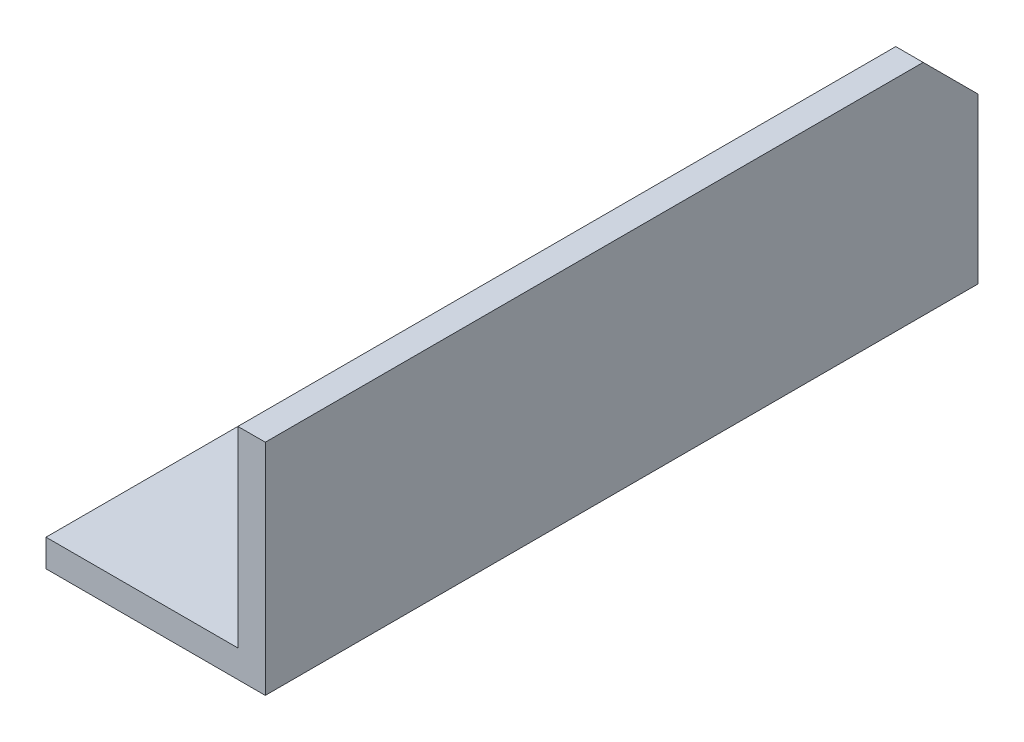
ISO-10303-21;
HEADER;
FILE_DESCRIPTION(('STEP AP214'),'2;1');
FILE_NAME('part.step','',(''),(''),'','','');
FILE_SCHEMA(('AUTOMOTIVE_DESIGN { 1 0 10303 214 1 1 1 1 }'));
ENDSEC;
DATA;
#1=APPLICATION_CONTEXT('core data for automotive mechanical design processes');
#2=APPLICATION_PROTOCOL_DEFINITION('international standard','automotive_design',2000,#1);
#3=PRODUCT_CONTEXT('',#1,'mechanical');
#4=PRODUCT('Part','Part','',(#3));
#5=PRODUCT_RELATED_PRODUCT_CATEGORY('part','',(#4));
#6=PRODUCT_DEFINITION_FORMATION('','',#4);
#7=PRODUCT_DEFINITION_CONTEXT('part definition',#1,'design');
#8=PRODUCT_DEFINITION('design','',#6,#7);
#9=PRODUCT_DEFINITION_SHAPE('','',#8);
#10=(LENGTH_UNIT() NAMED_UNIT(*) SI_UNIT(.MILLI.,.METRE.));
#11=(NAMED_UNIT(*) PLANE_ANGLE_UNIT() SI_UNIT($,.RADIAN.));
#12=(NAMED_UNIT(*) SI_UNIT($,.STERADIAN.) SOLID_ANGLE_UNIT());
#13=UNCERTAINTY_MEASURE_WITH_UNIT(LENGTH_MEASURE(1.E-05),#10,'distance_accuracy_value','');
#14=(GEOMETRIC_REPRESENTATION_CONTEXT(3) GLOBAL_UNCERTAINTY_ASSIGNED_CONTEXT((#13)) GLOBAL_UNIT_ASSIGNED_CONTEXT((#10,
#11,#12)) REPRESENTATION_CONTEXT('',''));
#15=CARTESIAN_POINT('',(0.,0.,0.));
#16=DIRECTION('',(0.,0.,1.));
#17=DIRECTION('',(1.,0.,0.));
#18=AXIS2_PLACEMENT_3D('',#15,#16,#17);
#19=CARTESIAN_POINT('',(0.,0.,-65.));
#20=DIRECTION('',(1.,0.,0.));
#21=DIRECTION('',(0.,0.,-1.));
#22=AXIS2_PLACEMENT_3D('',#19,#20,#21);
#23=PLANE('',#22);
#24=DIRECTION('',(0.,1.,0.));
#25=VECTOR('',#24,1.);
#26=CARTESIAN_POINT('',(0.,0.,-65.));
#27=LINE('',#26,#25);
#28=CARTESIAN_POINT('',(0.,0.,-65.));
#29=VERTEX_POINT('',#28);
#30=CARTESIAN_POINT('',(0.,30.,-65.));
#31=VERTEX_POINT('',#30);
#32=EDGE_CURVE('E127',#29,#31,#27,.T.);
#33=ORIENTED_EDGE('',*,*,#32,.T.);
#34=DIRECTION('',(0.,0.707106781186547,0.707106781186548));
#35=VECTOR('',#34,1.);
#36=CARTESIAN_POINT('',(0.,15.,-80.));
#37=LINE('',#36,#35);
#38=CARTESIAN_POINT('',(0.,40.,-55.));
#39=VERTEX_POINT('',#38);
#40=EDGE_CURVE('E55',#31,#39,#37,.T.);
#41=ORIENTED_EDGE('',*,*,#40,.T.);
#42=DIRECTION('',(0.,0.,1.));
#43=VECTOR('',#42,1.);
#44=CARTESIAN_POINT('',(0.,40.,-65.));
#45=LINE('',#44,#43);
#46=CARTESIAN_POINT('',(0.,40.,65.));
#47=VERTEX_POINT('',#46);
#48=EDGE_CURVE('E94',#39,#47,#45,.T.);
#49=ORIENTED_EDGE('',*,*,#48,.T.);
#50=DIRECTION('',(0.,1.,0.));
#51=VECTOR('',#50,1.);
#52=CARTESIAN_POINT('',(0.,0.,65.));
#53=LINE('',#52,#51);
#54=CARTESIAN_POINT('',(0.,0.,65.));
#55=VERTEX_POINT('',#54);
#56=EDGE_CURVE('E97',#55,#47,#53,.T.);
#57=ORIENTED_EDGE('',*,*,#56,.F.);
#58=DIRECTION('',(0.,0.,1.));
#59=VECTOR('',#58,1.);
#60=CARTESIAN_POINT('',(0.,0.,-65.));
#61=LINE('',#60,#59);
#62=EDGE_CURVE('E135',#29,#55,#61,.T.);
#63=ORIENTED_EDGE('',*,*,#62,.F.);
#64=EDGE_LOOP('',(#33,#41,#49,#57,#63));
#65=FACE_BOUND('',#64,.T.);
#66=ADVANCED_FACE('F33',(#65),#23,.T.);
#67=CARTESIAN_POINT('',(-40.,0.,-65.));
#68=DIRECTION('',(0.,-1.,0.));
#69=DIRECTION('',(0.,0.,-1.));
#70=AXIS2_PLACEMENT_3D('',#67,#68,#69);
#71=PLANE('',#70);
#72=CARTESIAN_POINT('',(-20.,0.,-38.));
#73=DIRECTION('',(0.,-1.,0.));
#74=DIRECTION('',(0.,0.,-1.));
#75=AXIS2_PLACEMENT_3D('',#72,#73,#74);
#76=CIRCLE('',#75,5.);
#77=CARTESIAN_POINT('',(-20.,0.,-43.));
#78=VERTEX_POINT('',#77);
#79=EDGE_CURVE('E112',#78,#78,#76,.T.);
#80=ORIENTED_EDGE('',*,*,#79,.F.);
#81=EDGE_LOOP('',(#80));
#82=FACE_BOUND('',#81,.T.);
#83=DIRECTION('',(0.,0.,1.));
#84=VECTOR('',#83,1.);
#85=CARTESIAN_POINT('',(-40.,0.,-65.));
#86=LINE('',#85,#84);
#87=CARTESIAN_POINT('',(-40.,0.,-55.));
#88=VERTEX_POINT('',#87);
#89=CARTESIAN_POINT('',(-40.,0.,65.));
#90=VERTEX_POINT('',#89);
#91=EDGE_CURVE('E138',#88,#90,#86,.T.);
#92=ORIENTED_EDGE('',*,*,#91,.F.);
#93=DIRECTION('',(0.707106781186547,0.,-0.707106781186548));
#94=VECTOR('',#93,1.);
#95=CARTESIAN_POINT('',(-35.,0.,-60.));
#96=LINE('',#95,#94);
#97=CARTESIAN_POINT('',(-30.,0.,-65.));
#98=VERTEX_POINT('',#97);
#99=EDGE_CURVE('E154',#88,#98,#96,.T.);
#100=ORIENTED_EDGE('',*,*,#99,.T.);
#101=DIRECTION('',(1.,0.,0.));
#102=VECTOR('',#101,1.);
#103=CARTESIAN_POINT('',(-40.,0.,-65.));
#104=LINE('',#103,#102);
#105=EDGE_CURVE('E100',#98,#29,#104,.T.);
#106=ORIENTED_EDGE('',*,*,#105,.T.);
#107=ORIENTED_EDGE('',*,*,#62,.T.);
#108=DIRECTION('',(1.,0.,0.));
#109=VECTOR('',#108,1.);
#110=CARTESIAN_POINT('',(-40.,0.,65.));
#111=LINE('',#110,#109);
#112=EDGE_CURVE('E111',#90,#55,#111,.T.);
#113=ORIENTED_EDGE('',*,*,#112,.F.);
#114=EDGE_LOOP('',(#92,#100,#106,#107,#113));
#115=FACE_BOUND('',#114,.T.);
#116=ADVANCED_FACE('F160',(#82,#115),#71,.T.);
#117=CARTESIAN_POINT('',(-40.,0.,-65.));
#118=DIRECTION('',(1.,0.,0.));
#119=DIRECTION('',(0.,0.,-1.));
#120=AXIS2_PLACEMENT_3D('',#117,#118,#119);
#121=PLANE('',#120);
#122=DIRECTION('',(0.,0.,1.));
#123=VECTOR('',#122,1.);
#124=CARTESIAN_POINT('',(-40.,5.,-65.));
#125=LINE('',#124,#123);
#126=CARTESIAN_POINT('',(-40.,5.,-55.));
#127=VERTEX_POINT('',#126);
#128=CARTESIAN_POINT('',(-40.,5.,65.));
#129=VERTEX_POINT('',#128);
#130=EDGE_CURVE('E140',#127,#129,#125,.T.);
#131=ORIENTED_EDGE('',*,*,#130,.F.);
#132=DIRECTION('',(0.,-1.,0.));
#133=VECTOR('',#132,1.);
#134=CARTESIAN_POINT('',(-40.,0.,-55.));
#135=LINE('',#134,#133);
#136=EDGE_CURVE('E152',#127,#88,#135,.T.);
#137=ORIENTED_EDGE('',*,*,#136,.T.);
#138=ORIENTED_EDGE('',*,*,#91,.T.);
#139=DIRECTION('',(0.,1.,0.));
#140=VECTOR('',#139,1.);
#141=CARTESIAN_POINT('',(-40.,0.,65.));
#142=LINE('',#141,#140);
#143=EDGE_CURVE('E123',#90,#129,#142,.T.);
#144=ORIENTED_EDGE('',*,*,#143,.T.);
#145=EDGE_LOOP('',(#131,#137,#138,#144));
#146=FACE_BOUND('',#145,.T.);
#147=ADVANCED_FACE('F175',(#146),#121,.F.);
#148=CARTESIAN_POINT('',(-40.,5.,-65.));
#149=DIRECTION('',(0.,-1.,0.));
#150=DIRECTION('',(0.,0.,-1.));
#151=AXIS2_PLACEMENT_3D('',#148,#149,#150);
#152=PLANE('',#151);
#153=CARTESIAN_POINT('',(-20.,5.,-38.));
#154=DIRECTION('',(0.,1.,0.));
#155=DIRECTION('',(0.,0.,1.));
#156=AXIS2_PLACEMENT_3D('',#153,#154,#155);
#157=CIRCLE('',#156,5.);
#158=CARTESIAN_POINT('',(-20.,5.,-33.));
#159=VERTEX_POINT('',#158);
#160=EDGE_CURVE('E274',#159,#159,#157,.T.);
#161=ORIENTED_EDGE('',*,*,#160,.F.);
#162=EDGE_LOOP('',(#161));
#163=FACE_BOUND('',#162,.T.);
#164=DIRECTION('',(1.,0.,0.));
#165=VECTOR('',#164,1.);
#166=CARTESIAN_POINT('',(-40.,5.,-65.));
#167=LINE('',#166,#165);
#168=CARTESIAN_POINT('',(-30.,5.,-65.));
#169=VERTEX_POINT('',#168);
#170=CARTESIAN_POINT('',(-5.,5.,-65.));
#171=VERTEX_POINT('',#170);
#172=EDGE_CURVE('E132',#169,#171,#167,.T.);
#173=ORIENTED_EDGE('',*,*,#172,.F.);
#174=DIRECTION('',(-0.707106781186547,0.,0.707106781186548));
#175=VECTOR('',#174,1.);
#176=CARTESIAN_POINT('',(-30.,5.,-65.));
#177=LINE('',#176,#175);
#178=EDGE_CURVE('E150',#169,#127,#177,.T.);
#179=ORIENTED_EDGE('',*,*,#178,.T.);
#180=ORIENTED_EDGE('',*,*,#130,.T.);
#181=DIRECTION('',(1.,0.,0.));
#182=VECTOR('',#181,1.);
#183=CARTESIAN_POINT('',(-40.,5.,65.));
#184=LINE('',#183,#182);
#185=CARTESIAN_POINT('',(-5.,5.,65.));
#186=VERTEX_POINT('',#185);
#187=EDGE_CURVE('E117',#129,#186,#184,.T.);
#188=ORIENTED_EDGE('',*,*,#187,.T.);
#189=DIRECTION('',(0.,0.,1.));
#190=VECTOR('',#189,1.);
#191=CARTESIAN_POINT('',(-5.,5.,-65.));
#192=LINE('',#191,#190);
#193=EDGE_CURVE('E142',#171,#186,#192,.T.);
#194=ORIENTED_EDGE('',*,*,#193,.F.);
#195=EDGE_LOOP('',(#173,#179,#180,#188,#194));
#196=FACE_BOUND('',#195,.T.);
#197=ADVANCED_FACE('F171',(#163,#196),#152,.F.);
#198=CARTESIAN_POINT('',(-5.,0.,-65.));
#199=DIRECTION('',(1.,0.,0.));
#200=DIRECTION('',(0.,0.,-1.));
#201=AXIS2_PLACEMENT_3D('',#198,#199,#200);
#202=PLANE('',#201);
#203=DIRECTION('',(0.,0.,1.));
#204=VECTOR('',#203,1.);
#205=CARTESIAN_POINT('',(-5.,40.,-65.));
#206=LINE('',#205,#204);
#207=CARTESIAN_POINT('',(-5.,40.,-55.));
#208=VERTEX_POINT('',#207);
#209=CARTESIAN_POINT('',(-5.,40.,65.));
#210=VERTEX_POINT('',#209);
#211=EDGE_CURVE('E99',#208,#210,#206,.T.);
#212=ORIENTED_EDGE('',*,*,#211,.F.);
#213=DIRECTION('',(0.,-0.707106781186547,-0.707106781186548));
#214=VECTOR('',#213,1.);
#215=CARTESIAN_POINT('',(-5.,30.,-65.));
#216=LINE('',#215,#214);
#217=CARTESIAN_POINT('',(-5.,30.,-65.));
#218=VERTEX_POINT('',#217);
#219=EDGE_CURVE('E11',#208,#218,#216,.T.);
#220=ORIENTED_EDGE('',*,*,#219,.T.);
#221=DIRECTION('',(0.,1.,0.));
#222=VECTOR('',#221,1.);
#223=CARTESIAN_POINT('',(-5.,0.,-65.));
#224=LINE('',#223,#222);
#225=EDGE_CURVE('E129',#171,#218,#224,.T.);
#226=ORIENTED_EDGE('',*,*,#225,.F.);
#227=ORIENTED_EDGE('',*,*,#193,.T.);
#228=DIRECTION('',(0.,1.,0.));
#229=VECTOR('',#228,1.);
#230=CARTESIAN_POINT('',(-5.,0.,65.));
#231=LINE('',#230,#229);
#232=EDGE_CURVE('E115',#186,#210,#231,.T.);
#233=ORIENTED_EDGE('',*,*,#232,.T.);
#234=EDGE_LOOP('',(#212,#220,#226,#227,#233));
#235=FACE_BOUND('',#234,.T.);
#236=ADVANCED_FACE('F178',(#235),#202,.F.);
#237=CARTESIAN_POINT('',(-5.,40.,-65.));
#238=DIRECTION('',(0.,-1.,0.));
#239=DIRECTION('',(0.,0.,-1.));
#240=AXIS2_PLACEMENT_3D('',#237,#238,#239);
#241=PLANE('',#240);
#242=ORIENTED_EDGE('',*,*,#48,.F.);
#243=DIRECTION('',(-1.,0.,0.));
#244=VECTOR('',#243,1.);
#245=CARTESIAN_POINT('',(-5.,40.,-55.));
#246=LINE('',#245,#244);
#247=EDGE_CURVE('E41',#39,#208,#246,.T.);
#248=ORIENTED_EDGE('',*,*,#247,.T.);
#249=ORIENTED_EDGE('',*,*,#211,.T.);
#250=DIRECTION('',(1.,0.,0.));
#251=VECTOR('',#250,1.);
#252=CARTESIAN_POINT('',(-5.,40.,65.));
#253=LINE('',#252,#251);
#254=EDGE_CURVE('E107',#210,#47,#253,.T.);
#255=ORIENTED_EDGE('',*,*,#254,.T.);
#256=EDGE_LOOP('',(#242,#248,#249,#255));
#257=FACE_BOUND('',#256,.T.);
#258=ADVANCED_FACE('F114',(#257),#241,.F.);
#259=CARTESIAN_POINT('',(0.,0.,-65.));
#260=DIRECTION('',(0.,0.,-1.));
#261=DIRECTION('',(-1.,0.,0.));
#262=AXIS2_PLACEMENT_3D('',#259,#260,#261);
#263=PLANE('',#262);
#264=ORIENTED_EDGE('',*,*,#105,.F.);
#265=DIRECTION('',(0.,1.,0.));
#266=VECTOR('',#265,1.);
#267=CARTESIAN_POINT('',(-30.,5.,-65.));
#268=LINE('',#267,#266);
#269=EDGE_CURVE('E147',#98,#169,#268,.T.);
#270=ORIENTED_EDGE('',*,*,#269,.T.);
#271=ORIENTED_EDGE('',*,*,#172,.T.);
#272=ORIENTED_EDGE('',*,*,#225,.T.);
#273=DIRECTION('',(1.,0.,0.));
#274=VECTOR('',#273,1.);
#275=CARTESIAN_POINT('',(0.,30.,-65.));
#276=LINE('',#275,#274);
#277=EDGE_CURVE('E137',#218,#31,#276,.T.);
#278=ORIENTED_EDGE('',*,*,#277,.T.);
#279=ORIENTED_EDGE('',*,*,#32,.F.);
#280=EDGE_LOOP('',(#264,#270,#271,#272,#278,#279));
#281=FACE_BOUND('',#280,.T.);
#282=ADVANCED_FACE('F166',(#281),#263,.T.);
#283=CARTESIAN_POINT('',(0.,0.,65.));
#284=DIRECTION('',(0.,0.,-1.));
#285=DIRECTION('',(-1.,0.,0.));
#286=AXIS2_PLACEMENT_3D('',#283,#284,#285);
#287=PLANE('',#286);
#288=ORIENTED_EDGE('',*,*,#56,.T.);
#289=ORIENTED_EDGE('',*,*,#254,.F.);
#290=ORIENTED_EDGE('',*,*,#232,.F.);
#291=ORIENTED_EDGE('',*,*,#187,.F.);
#292=ORIENTED_EDGE('',*,*,#143,.F.);
#293=ORIENTED_EDGE('',*,*,#112,.T.);
#294=EDGE_LOOP('',(#288,#289,#290,#291,#292,#293));
#295=FACE_BOUND('',#294,.T.);
#296=ADVANCED_FACE('F105',(#295),#287,.F.);
#297=CARTESIAN_POINT('',(-30.,0.,-65.));
#298=DIRECTION('',(-0.707106781186548,0.,-0.707106781186547));
#299=DIRECTION('',(0.,-1.,0.));
#300=AXIS2_PLACEMENT_3D('',#297,#298,#299);
#301=PLANE('',#300);
#302=ORIENTED_EDGE('',*,*,#99,.F.);
#303=ORIENTED_EDGE('',*,*,#136,.F.);
#304=ORIENTED_EDGE('',*,*,#178,.F.);
#305=ORIENTED_EDGE('',*,*,#269,.F.);
#306=EDGE_LOOP('',(#302,#303,#304,#305));
#307=FACE_BOUND('',#306,.T.);
#308=ADVANCED_FACE('F168',(#307),#301,.T.);
#309=CARTESIAN_POINT('',(0.,30.,-65.));
#310=DIRECTION('',(0.,0.707106781186548,-0.707106781186547));
#311=DIRECTION('',(-1.,0.,0.));
#312=AXIS2_PLACEMENT_3D('',#309,#310,#311);
#313=PLANE('',#312);
#314=ORIENTED_EDGE('',*,*,#219,.F.);
#315=ORIENTED_EDGE('',*,*,#247,.F.);
#316=ORIENTED_EDGE('',*,*,#40,.F.);
#317=ORIENTED_EDGE('',*,*,#277,.F.);
#318=EDGE_LOOP('',(#314,#315,#316,#317));
#319=FACE_BOUND('',#318,.T.);
#320=ADVANCED_FACE('F35',(#319),#313,.T.);
#321=CARTESIAN_POINT('',(-20.,-5.,-38.));
#322=DIRECTION('',(0.,1.,0.));
#323=DIRECTION('',(0.,0.,1.));
#324=AXIS2_PLACEMENT_3D('',#321,#322,#323);
#325=CYLINDRICAL_SURFACE('',#324,5.);
#326=ORIENTED_EDGE('',*,*,#79,.T.);
#327=EDGE_LOOP('',(#326));
#328=FACE_BOUND('',#327,.T.);
#329=ORIENTED_EDGE('',*,*,#160,.T.);
#330=EDGE_LOOP('',(#329));
#331=FACE_BOUND('',#330,.T.);
#332=ADVANCED_FACE('F183',(#328,#331),#325,.F.);
#333=CLOSED_SHELL('',(#66,#116,#147,#197,#236,#258,#282,#296,#308,#320,#332));
#334=MANIFOLD_SOLID_BREP('B2',#333);
#335=ADVANCED_BREP_SHAPE_REPRESENTATION('',(#18,#334),#14);
#336=SHAPE_DEFINITION_REPRESENTATION(#9,#335);
ENDSEC;
END-ISO-10303-21;
